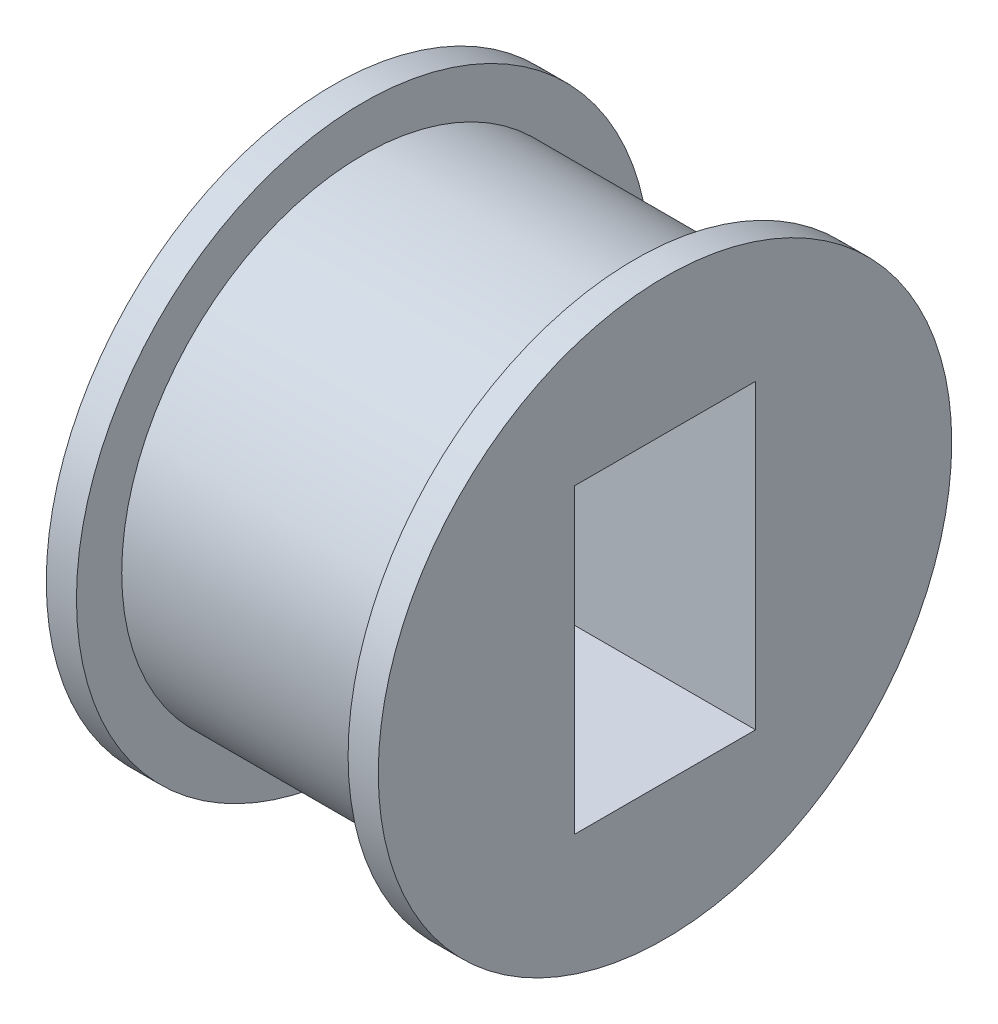
ISO-10303-21;
HEADER;
FILE_DESCRIPTION(('STEP AP214'),'2;1');
FILE_NAME('part.step','',(''),(''),'','','');
FILE_SCHEMA(('AUTOMOTIVE_DESIGN { 1 0 10303 214 1 1 1 1 }'));
ENDSEC;
DATA;
#1=APPLICATION_CONTEXT('core data for automotive mechanical design processes');
#2=APPLICATION_PROTOCOL_DEFINITION('international standard','automotive_design',2000,#1);
#3=PRODUCT_CONTEXT('',#1,'mechanical');
#4=PRODUCT('Part','Part','',(#3));
#5=PRODUCT_RELATED_PRODUCT_CATEGORY('part','',(#4));
#6=PRODUCT_DEFINITION_FORMATION('','',#4);
#7=PRODUCT_DEFINITION_CONTEXT('part definition',#1,'design');
#8=PRODUCT_DEFINITION('design','',#6,#7);
#9=PRODUCT_DEFINITION_SHAPE('','',#8);
#10=(LENGTH_UNIT() NAMED_UNIT(*) SI_UNIT(.MILLI.,.METRE.));
#11=(NAMED_UNIT(*) PLANE_ANGLE_UNIT() SI_UNIT($,.RADIAN.));
#12=(NAMED_UNIT(*) SI_UNIT($,.STERADIAN.) SOLID_ANGLE_UNIT());
#13=UNCERTAINTY_MEASURE_WITH_UNIT(LENGTH_MEASURE(1.E-05),#10,'distance_accuracy_value','');
#14=(GEOMETRIC_REPRESENTATION_CONTEXT(3) GLOBAL_UNCERTAINTY_ASSIGNED_CONTEXT((#13)) GLOBAL_UNIT_ASSIGNED_CONTEXT((#10,
#11,#12)) REPRESENTATION_CONTEXT('',''));
#15=CARTESIAN_POINT('',(0.,0.,0.));
#16=DIRECTION('',(0.,0.,1.));
#17=DIRECTION('',(1.,0.,0.));
#18=AXIS2_PLACEMENT_3D('',#15,#16,#17);
#19=CARTESIAN_POINT('',(25.,0.,0.));
#20=DIRECTION('',(-1.,0.,0.));
#21=DIRECTION('',(0.,0.,1.));
#22=AXIS2_PLACEMENT_3D('',#19,#20,#21);
#23=CYLINDRICAL_SURFACE('',#22,40.);
#24=CARTESIAN_POINT('',(22.5,0.,0.));
#25=DIRECTION('',(1.,0.,0.));
#26=DIRECTION('',(0.,0.,-1.));
#27=AXIS2_PLACEMENT_3D('',#24,#25,#26);
#28=CIRCLE('',#27,40.);
#29=CARTESIAN_POINT('',(22.5,0.,-40.));
#30=VERTEX_POINT('',#29);
#31=EDGE_CURVE('E44',#30,#30,#28,.T.);
#32=ORIENTED_EDGE('',*,*,#31,.F.);
#33=EDGE_LOOP('',(#32));
#34=FACE_BOUND('',#33,.T.);
#35=CARTESIAN_POINT('',(-22.5,0.,0.));
#36=DIRECTION('',(-1.,0.,0.));
#37=DIRECTION('',(0.,0.,1.));
#38=AXIS2_PLACEMENT_3D('',#35,#36,#37);
#39=CIRCLE('',#38,40.);
#40=CARTESIAN_POINT('',(-22.5,0.,40.));
#41=VERTEX_POINT('',#40);
#42=EDGE_CURVE('E11',#41,#41,#39,.T.);
#43=ORIENTED_EDGE('',*,*,#42,.F.);
#44=EDGE_LOOP('',(#43));
#45=FACE_BOUND('',#44,.T.);
#46=ADVANCED_FACE('F37',(#34,#45),#23,.T.);
#47=CARTESIAN_POINT('',(27.5,0.,0.));
#48=DIRECTION('',(-1.,0.,0.));
#49=DIRECTION('',(0.,0.,1.));
#50=AXIS2_PLACEMENT_3D('',#47,#48,#49);
#51=CYLINDRICAL_SURFACE('',#50,47.5);
#52=CARTESIAN_POINT('',(27.5,0.,0.));
#53=DIRECTION('',(1.,0.,0.));
#54=DIRECTION('',(0.,0.,-1.));
#55=AXIS2_PLACEMENT_3D('',#52,#53,#54);
#56=CIRCLE('',#55,47.5);
#57=CARTESIAN_POINT('',(27.5,0.,-47.5));
#58=VERTEX_POINT('',#57);
#59=EDGE_CURVE('E120',#58,#58,#56,.T.);
#60=ORIENTED_EDGE('',*,*,#59,.F.);
#61=EDGE_LOOP('',(#60));
#62=FACE_BOUND('',#61,.T.);
#63=CARTESIAN_POINT('',(22.5,0.,0.));
#64=DIRECTION('',(1.,0.,0.));
#65=DIRECTION('',(0.,0.,-1.));
#66=AXIS2_PLACEMENT_3D('',#63,#64,#65);
#67=CIRCLE('',#66,47.5);
#68=CARTESIAN_POINT('',(22.5,0.,-47.5));
#69=VERTEX_POINT('',#68);
#70=EDGE_CURVE('E117',#69,#69,#67,.T.);
#71=ORIENTED_EDGE('',*,*,#70,.T.);
#72=EDGE_LOOP('',(#71));
#73=FACE_BOUND('',#72,.T.);
#74=ADVANCED_FACE('F132',(#62,#73),#51,.T.);
#75=CARTESIAN_POINT('',(27.5,0.,0.));
#76=DIRECTION('',(1.,0.,0.));
#77=DIRECTION('',(0.,0.,-1.));
#78=AXIS2_PLACEMENT_3D('',#75,#76,#77);
#79=PLANE('',#78);
#80=DIRECTION('',(0.,1.,0.));
#81=VECTOR('',#80,1.);
#82=CARTESIAN_POINT('',(27.5,25.,-15.));
#83=LINE('',#82,#81);
#84=CARTESIAN_POINT('',(27.5,-25.,-15.));
#85=VERTEX_POINT('',#84);
#86=CARTESIAN_POINT('',(27.5,25.,-15.));
#87=VERTEX_POINT('',#86);
#88=EDGE_CURVE('E51',#85,#87,#83,.T.);
#89=ORIENTED_EDGE('',*,*,#88,.F.);
#90=DIRECTION('',(0.,0.,-1.));
#91=VECTOR('',#90,1.);
#92=CARTESIAN_POINT('',(27.5,-25.,15.));
#93=LINE('',#92,#91);
#94=CARTESIAN_POINT('',(27.5,-25.,15.));
#95=VERTEX_POINT('',#94);
#96=EDGE_CURVE('E95',#95,#85,#93,.T.);
#97=ORIENTED_EDGE('',*,*,#96,.F.);
#98=DIRECTION('',(0.,-1.,0.));
#99=VECTOR('',#98,1.);
#100=CARTESIAN_POINT('',(27.5,25.,15.));
#101=LINE('',#100,#99);
#102=CARTESIAN_POINT('',(27.5,25.,15.));
#103=VERTEX_POINT('',#102);
#104=EDGE_CURVE('E79',#103,#95,#101,.T.);
#105=ORIENTED_EDGE('',*,*,#104,.F.);
#106=DIRECTION('',(0.,0.,1.));
#107=VECTOR('',#106,1.);
#108=CARTESIAN_POINT('',(27.5,25.,15.));
#109=LINE('',#108,#107);
#110=EDGE_CURVE('E88',#87,#103,#109,.T.);
#111=ORIENTED_EDGE('',*,*,#110,.F.);
#112=EDGE_LOOP('',(#89,#97,#105,#111));
#113=FACE_BOUND('',#112,.T.);
#114=ORIENTED_EDGE('',*,*,#59,.T.);
#115=EDGE_LOOP('',(#114));
#116=FACE_BOUND('',#115,.T.);
#117=ADVANCED_FACE('F92',(#113,#116),#79,.T.);
#118=CARTESIAN_POINT('',(22.5,0.,0.));
#119=DIRECTION('',(1.,0.,0.));
#120=DIRECTION('',(0.,0.,-1.));
#121=AXIS2_PLACEMENT_3D('',#118,#119,#120);
#122=PLANE('',#121);
#123=ORIENTED_EDGE('',*,*,#31,.T.);
#124=EDGE_LOOP('',(#123));
#125=FACE_BOUND('',#124,.T.);
#126=ORIENTED_EDGE('',*,*,#70,.F.);
#127=EDGE_LOOP('',(#126));
#128=FACE_BOUND('',#127,.T.);
#129=ADVANCED_FACE('F127',(#125,#128),#122,.F.);
#130=CARTESIAN_POINT('',(-27.5,0.,0.));
#131=DIRECTION('',(1.,0.,0.));
#132=DIRECTION('',(0.,0.,-1.));
#133=AXIS2_PLACEMENT_3D('',#130,#131,#132);
#134=CYLINDRICAL_SURFACE('',#133,47.5);
#135=CARTESIAN_POINT('',(-27.5,0.,0.));
#136=DIRECTION('',(1.,0.,0.));
#137=DIRECTION('',(0.,0.,-1.));
#138=AXIS2_PLACEMENT_3D('',#135,#136,#137);
#139=CIRCLE('',#138,47.5);
#140=CARTESIAN_POINT('',(-27.5,0.,-47.5));
#141=VERTEX_POINT('',#140);
#142=EDGE_CURVE('E114',#141,#141,#139,.T.);
#143=ORIENTED_EDGE('',*,*,#142,.T.);
#144=EDGE_LOOP('',(#143));
#145=FACE_BOUND('',#144,.T.);
#146=CARTESIAN_POINT('',(-22.5,0.,0.));
#147=DIRECTION('',(1.,0.,0.));
#148=DIRECTION('',(0.,0.,-1.));
#149=AXIS2_PLACEMENT_3D('',#146,#147,#148);
#150=CIRCLE('',#149,47.5);
#151=CARTESIAN_POINT('',(-22.5,0.,-47.5));
#152=VERTEX_POINT('',#151);
#153=EDGE_CURVE('E111',#152,#152,#150,.T.);
#154=ORIENTED_EDGE('',*,*,#153,.F.);
#155=EDGE_LOOP('',(#154));
#156=FACE_BOUND('',#155,.T.);
#157=ADVANCED_FACE('F143',(#145,#156),#134,.T.);
#158=CARTESIAN_POINT('',(-27.5,0.,0.));
#159=DIRECTION('',(-1.,0.,0.));
#160=DIRECTION('',(0.,0.,-1.));
#161=AXIS2_PLACEMENT_3D('',#158,#159,#160);
#162=PLANE('',#161);
#163=DIRECTION('',(0.,1.,0.));
#164=VECTOR('',#163,1.);
#165=CARTESIAN_POINT('',(-27.5,25.,-15.));
#166=LINE('',#165,#164);
#167=CARTESIAN_POINT('',(-27.5,-25.,-15.));
#168=VERTEX_POINT('',#167);
#169=CARTESIAN_POINT('',(-27.5,25.,-15.));
#170=VERTEX_POINT('',#169);
#171=EDGE_CURVE('E97',#168,#170,#166,.T.);
#172=ORIENTED_EDGE('',*,*,#171,.T.);
#173=DIRECTION('',(0.,0.,1.));
#174=VECTOR('',#173,1.);
#175=CARTESIAN_POINT('',(-27.5,25.,15.));
#176=LINE('',#175,#174);
#177=CARTESIAN_POINT('',(-27.5,25.,15.));
#178=VERTEX_POINT('',#177);
#179=EDGE_CURVE('E103',#170,#178,#176,.T.);
#180=ORIENTED_EDGE('',*,*,#179,.T.);
#181=DIRECTION('',(0.,-1.,0.));
#182=VECTOR('',#181,1.);
#183=CARTESIAN_POINT('',(-27.5,25.,15.));
#184=LINE('',#183,#182);
#185=CARTESIAN_POINT('',(-27.5,-25.,15.));
#186=VERTEX_POINT('',#185);
#187=EDGE_CURVE('E59',#178,#186,#184,.T.);
#188=ORIENTED_EDGE('',*,*,#187,.T.);
#189=DIRECTION('',(0.,0.,-1.));
#190=VECTOR('',#189,1.);
#191=CARTESIAN_POINT('',(-27.5,-25.,15.));
#192=LINE('',#191,#190);
#193=EDGE_CURVE('E106',#186,#168,#192,.T.);
#194=ORIENTED_EDGE('',*,*,#193,.T.);
#195=EDGE_LOOP('',(#172,#180,#188,#194));
#196=FACE_BOUND('',#195,.T.);
#197=ORIENTED_EDGE('',*,*,#142,.F.);
#198=EDGE_LOOP('',(#197));
#199=FACE_BOUND('',#198,.T.);
#200=ADVANCED_FACE('F139',(#196,#199),#162,.T.);
#201=CARTESIAN_POINT('',(-22.5,0.,0.));
#202=DIRECTION('',(-1.,0.,0.));
#203=DIRECTION('',(0.,0.,-1.));
#204=AXIS2_PLACEMENT_3D('',#201,#202,#203);
#205=PLANE('',#204);
#206=ORIENTED_EDGE('',*,*,#42,.T.);
#207=EDGE_LOOP('',(#206));
#208=FACE_BOUND('',#207,.T.);
#209=ORIENTED_EDGE('',*,*,#153,.T.);
#210=EDGE_LOOP('',(#209));
#211=FACE_BOUND('',#210,.T.);
#212=ADVANCED_FACE('F135',(#208,#211),#205,.F.);
#213=CARTESIAN_POINT('',(-27.5,25.,-15.));
#214=DIRECTION('',(0.,0.,-1.));
#215=DIRECTION('',(0.,1.,0.));
#216=AXIS2_PLACEMENT_3D('',#213,#214,#215);
#217=PLANE('',#216);
#218=DIRECTION('',(1.,0.,0.));
#219=VECTOR('',#218,1.);
#220=CARTESIAN_POINT('',(-27.5,25.,-15.));
#221=LINE('',#220,#219);
#222=EDGE_CURVE('E85',#170,#87,#221,.T.);
#223=ORIENTED_EDGE('',*,*,#222,.F.);
#224=ORIENTED_EDGE('',*,*,#171,.F.);
#225=DIRECTION('',(1.,0.,0.));
#226=VECTOR('',#225,1.);
#227=CARTESIAN_POINT('',(-27.5,-25.,-15.));
#228=LINE('',#227,#226);
#229=EDGE_CURVE('E109',#168,#85,#228,.T.);
#230=ORIENTED_EDGE('',*,*,#229,.T.);
#231=ORIENTED_EDGE('',*,*,#88,.T.);
#232=EDGE_LOOP('',(#223,#224,#230,#231));
#233=FACE_BOUND('',#232,.T.);
#234=ADVANCED_FACE('F138',(#233),#217,.F.);
#235=CARTESIAN_POINT('',(-27.5,-25.,15.));
#236=DIRECTION('',(0.,-1.,0.));
#237=DIRECTION('',(0.,0.,-1.));
#238=AXIS2_PLACEMENT_3D('',#235,#236,#237);
#239=PLANE('',#238);
#240=ORIENTED_EDGE('',*,*,#229,.F.);
#241=ORIENTED_EDGE('',*,*,#193,.F.);
#242=DIRECTION('',(1.,0.,0.));
#243=VECTOR('',#242,1.);
#244=CARTESIAN_POINT('',(-27.5,-25.,15.));
#245=LINE('',#244,#243);
#246=EDGE_CURVE('E84',#186,#95,#245,.T.);
#247=ORIENTED_EDGE('',*,*,#246,.T.);
#248=ORIENTED_EDGE('',*,*,#96,.T.);
#249=EDGE_LOOP('',(#240,#241,#247,#248));
#250=FACE_BOUND('',#249,.T.);
#251=ADVANCED_FACE('F203',(#250),#239,.F.);
#252=CARTESIAN_POINT('',(-27.5,25.,15.));
#253=DIRECTION('',(0.,0.,1.));
#254=DIRECTION('',(0.,-1.,0.));
#255=AXIS2_PLACEMENT_3D('',#252,#253,#254);
#256=PLANE('',#255);
#257=ORIENTED_EDGE('',*,*,#246,.F.);
#258=ORIENTED_EDGE('',*,*,#187,.F.);
#259=DIRECTION('',(1.,0.,0.));
#260=VECTOR('',#259,1.);
#261=CARTESIAN_POINT('',(-27.5,25.,15.));
#262=LINE('',#261,#260);
#263=EDGE_CURVE('E75',#178,#103,#262,.T.);
#264=ORIENTED_EDGE('',*,*,#263,.T.);
#265=ORIENTED_EDGE('',*,*,#104,.T.);
#266=EDGE_LOOP('',(#257,#258,#264,#265));
#267=FACE_BOUND('',#266,.T.);
#268=ADVANCED_FACE('F77',(#267),#256,.F.);
#269=CARTESIAN_POINT('',(-27.5,25.,15.));
#270=DIRECTION('',(0.,1.,0.));
#271=DIRECTION('',(0.,0.,1.));
#272=AXIS2_PLACEMENT_3D('',#269,#270,#271);
#273=PLANE('',#272);
#274=ORIENTED_EDGE('',*,*,#263,.F.);
#275=ORIENTED_EDGE('',*,*,#179,.F.);
#276=ORIENTED_EDGE('',*,*,#222,.T.);
#277=ORIENTED_EDGE('',*,*,#110,.T.);
#278=EDGE_LOOP('',(#274,#275,#276,#277));
#279=FACE_BOUND('',#278,.T.);
#280=ADVANCED_FACE('F89',(#279),#273,.F.);
#281=CLOSED_SHELL('',(#46,#74,#117,#129,#157,#200,#212,#234,#251,#268,#280));
#282=MANIFOLD_SOLID_BREP('B2',#281);
#283=ADVANCED_BREP_SHAPE_REPRESENTATION('',(#18,#282),#14);
#284=SHAPE_DEFINITION_REPRESENTATION(#9,#283);
ENDSEC;
END-ISO-10303-21;
